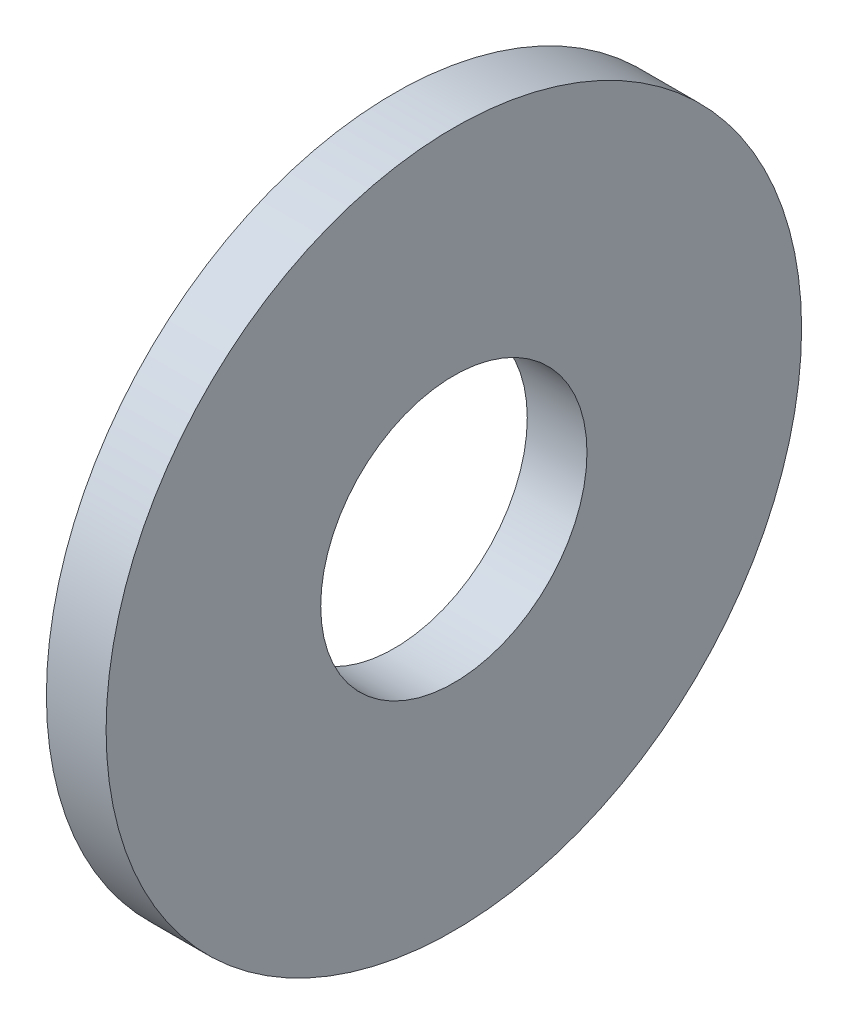
ISO-10303-21;
HEADER;
FILE_DESCRIPTION(('STEP AP214'),'2;1');
FILE_NAME('part.step','',(''),(''),'','','');
FILE_SCHEMA(('AUTOMOTIVE_DESIGN { 1 0 10303 214 1 1 1 1 }'));
ENDSEC;
DATA;
#1=APPLICATION_CONTEXT('core data for automotive mechanical design processes');
#2=APPLICATION_PROTOCOL_DEFINITION('international standard','automotive_design',2000,#1);
#3=PRODUCT_CONTEXT('',#1,'mechanical');
#4=PRODUCT('Part','Part','',(#3));
#5=PRODUCT_RELATED_PRODUCT_CATEGORY('part','',(#4));
#6=PRODUCT_DEFINITION_FORMATION('','',#4);
#7=PRODUCT_DEFINITION_CONTEXT('part definition',#1,'design');
#8=PRODUCT_DEFINITION('design','',#6,#7);
#9=PRODUCT_DEFINITION_SHAPE('','',#8);
#10=(LENGTH_UNIT() NAMED_UNIT(*) SI_UNIT(.MILLI.,.METRE.));
#11=(NAMED_UNIT(*) PLANE_ANGLE_UNIT() SI_UNIT($,.RADIAN.));
#12=(NAMED_UNIT(*) SI_UNIT($,.STERADIAN.) SOLID_ANGLE_UNIT());
#13=UNCERTAINTY_MEASURE_WITH_UNIT(LENGTH_MEASURE(1.E-05),#10,'distance_accuracy_value','');
#14=(GEOMETRIC_REPRESENTATION_CONTEXT(3) GLOBAL_UNCERTAINTY_ASSIGNED_CONTEXT((#13)) GLOBAL_UNIT_ASSIGNED_CONTEXT((#10,
#11,#12)) REPRESENTATION_CONTEXT('',''));
#15=CARTESIAN_POINT('',(0.,0.,0.));
#16=DIRECTION('',(0.,0.,1.));
#17=DIRECTION('',(1.,0.,0.));
#18=AXIS2_PLACEMENT_3D('',#15,#16,#17);
#19=CARTESIAN_POINT('',(-34.9249999999999,0.,0.));
#20=DIRECTION('',(-1.,0.,0.));
#21=DIRECTION('',(0.,0.,1.));
#22=AXIS2_PLACEMENT_3D('',#19,#20,#21);
#23=CYLINDRICAL_SURFACE('',#22,3.5687);
#24=CARTESIAN_POINT('',(0.,0.,0.));
#25=DIRECTION('',(-1.,0.,0.));
#26=DIRECTION('',(0.,0.,1.));
#27=AXIS2_PLACEMENT_3D('',#24,#25,#26);
#28=CIRCLE('',#27,3.5687);
#29=CARTESIAN_POINT('',(0.,0.,3.5687));
#30=VERTEX_POINT('',#29);
#31=EDGE_CURVE('E10',#30,#30,#28,.T.);
#32=ORIENTED_EDGE('',*,*,#31,.F.);
#33=EDGE_LOOP('',(#32));
#34=FACE_BOUND('',#33,.T.);
#35=CARTESIAN_POINT('',(-1.6002,0.,0.));
#36=DIRECTION('',(-1.,0.,0.));
#37=DIRECTION('',(0.,0.,1.));
#38=AXIS2_PLACEMENT_3D('',#35,#36,#37);
#39=CIRCLE('',#38,3.5687);
#40=CARTESIAN_POINT('',(-1.6002,0.,3.5687));
#41=VERTEX_POINT('',#40);
#42=EDGE_CURVE('E47',#41,#41,#39,.T.);
#43=ORIENTED_EDGE('',*,*,#42,.T.);
#44=EDGE_LOOP('',(#43));
#45=FACE_BOUND('',#44,.T.);
#46=ADVANCED_FACE('F33',(#34,#45),#23,.F.);
#47=CARTESIAN_POINT('',(0.,3.5687,0.));
#48=DIRECTION('',(-1.,0.,0.));
#49=DIRECTION('',(0.,0.,1.));
#50=AXIS2_PLACEMENT_3D('',#47,#48,#49);
#51=PLANE('',#50);
#52=CARTESIAN_POINT('',(0.,0.,0.));
#53=DIRECTION('',(-1.,0.,0.));
#54=DIRECTION('',(0.,0.,1.));
#55=AXIS2_PLACEMENT_3D('',#52,#53,#54);
#56=CIRCLE('',#55,9.3218);
#57=CARTESIAN_POINT('',(0.,0.,9.3218));
#58=VERTEX_POINT('',#57);
#59=EDGE_CURVE('E39',#58,#58,#56,.T.);
#60=ORIENTED_EDGE('',*,*,#59,.F.);
#61=EDGE_LOOP('',(#60));
#62=FACE_BOUND('',#61,.T.);
#63=ORIENTED_EDGE('',*,*,#31,.T.);
#64=EDGE_LOOP('',(#63));
#65=FACE_BOUND('',#64,.T.);
#66=ADVANCED_FACE('F62',(#62,#65),#51,.F.);
#67=CARTESIAN_POINT('',(-34.9249999999999,0.,0.));
#68=DIRECTION('',(-1.,0.,0.));
#69=DIRECTION('',(0.,0.,1.));
#70=AXIS2_PLACEMENT_3D('',#67,#68,#69);
#71=CYLINDRICAL_SURFACE('',#70,9.3218);
#72=CARTESIAN_POINT('',(-1.6002,0.,0.));
#73=DIRECTION('',(-1.,0.,0.));
#74=DIRECTION('',(0.,0.,1.));
#75=AXIS2_PLACEMENT_3D('',#72,#73,#74);
#76=CIRCLE('',#75,9.3218);
#77=CARTESIAN_POINT('',(-1.6002,0.,9.3218));
#78=VERTEX_POINT('',#77);
#79=EDGE_CURVE('E43',#78,#78,#76,.T.);
#80=ORIENTED_EDGE('',*,*,#79,.F.);
#81=EDGE_LOOP('',(#80));
#82=FACE_BOUND('',#81,.T.);
#83=ORIENTED_EDGE('',*,*,#59,.T.);
#84=EDGE_LOOP('',(#83));
#85=FACE_BOUND('',#84,.T.);
#86=ADVANCED_FACE('F57',(#82,#85),#71,.T.);
#87=CARTESIAN_POINT('',(-1.6002,9.3218,0.));
#88=DIRECTION('',(1.,0.,0.));
#89=DIRECTION('',(0.,0.,-1.));
#90=AXIS2_PLACEMENT_3D('',#87,#88,#89);
#91=PLANE('',#90);
#92=ORIENTED_EDGE('',*,*,#42,.F.);
#93=EDGE_LOOP('',(#92));
#94=FACE_BOUND('',#93,.T.);
#95=ORIENTED_EDGE('',*,*,#79,.T.);
#96=EDGE_LOOP('',(#95));
#97=FACE_BOUND('',#96,.T.);
#98=ADVANCED_FACE('F54',(#94,#97),#91,.F.);
#99=CLOSED_SHELL('',(#46,#66,#86,#98));
#100=MANIFOLD_SOLID_BREP('B2',#99);
#101=ADVANCED_BREP_SHAPE_REPRESENTATION('',(#18,#100),#14);
#102=SHAPE_DEFINITION_REPRESENTATION(#9,#101);
ENDSEC;
END-ISO-10303-21;
